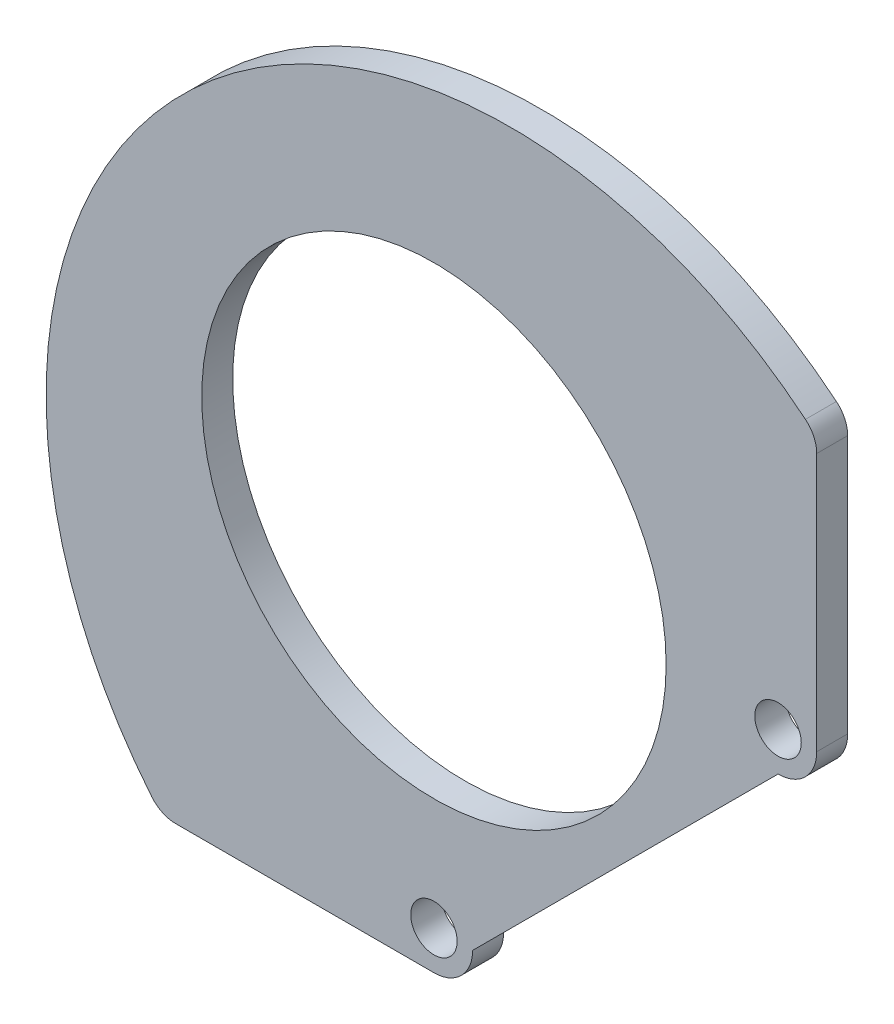
ISO-10303-21;
HEADER;
FILE_DESCRIPTION(('STEP AP214'),'2;1');
FILE_NAME('part.step','',(''),(''),'','','');
FILE_SCHEMA(('AUTOMOTIVE_DESIGN { 1 0 10303 214 1 1 1 1 }'));
ENDSEC;
DATA;
#1=APPLICATION_CONTEXT('core data for automotive mechanical design processes');
#2=APPLICATION_PROTOCOL_DEFINITION('international standard','automotive_design',2000,#1);
#3=PRODUCT_CONTEXT('',#1,'mechanical');
#4=PRODUCT('Part','Part','',(#3));
#5=PRODUCT_RELATED_PRODUCT_CATEGORY('part','',(#4));
#6=PRODUCT_DEFINITION_FORMATION('','',#4);
#7=PRODUCT_DEFINITION_CONTEXT('part definition',#1,'design');
#8=PRODUCT_DEFINITION('design','',#6,#7);
#9=PRODUCT_DEFINITION_SHAPE('','',#8);
#10=(LENGTH_UNIT() NAMED_UNIT(*) SI_UNIT(.MILLI.,.METRE.));
#11=(NAMED_UNIT(*) PLANE_ANGLE_UNIT() SI_UNIT($,.RADIAN.));
#12=(NAMED_UNIT(*) SI_UNIT($,.STERADIAN.) SOLID_ANGLE_UNIT());
#13=UNCERTAINTY_MEASURE_WITH_UNIT(LENGTH_MEASURE(1.E-05),#10,'distance_accuracy_value','');
#14=(GEOMETRIC_REPRESENTATION_CONTEXT(3) GLOBAL_UNCERTAINTY_ASSIGNED_CONTEXT((#13)) GLOBAL_UNIT_ASSIGNED_CONTEXT((#10,
#11,#12)) REPRESENTATION_CONTEXT('',''));
#15=CARTESIAN_POINT('',(0.,0.,0.));
#16=DIRECTION('',(0.,0.,1.));
#17=DIRECTION('',(1.,0.,0.));
#18=AXIS2_PLACEMENT_3D('',#15,#16,#17);
#19=CARTESIAN_POINT('',(-4.94974746830583,4.94974746830583,2.));
#20=DIRECTION('',(0.,0.,-1.));
#21=DIRECTION('',(-1.,0.,0.));
#22=AXIS2_PLACEMENT_3D('',#19,#20,#21);
#23=CYLINDRICAL_SURFACE('',#22,15.);
#24=CARTESIAN_POINT('',(-4.94974746830583,4.94974746830583,2.));
#25=DIRECTION('',(0.,0.,1.));
#26=DIRECTION('',(1.,0.,0.));
#27=AXIS2_PLACEMENT_3D('',#24,#25,#26);
#28=CIRCLE('',#27,15.);
#29=CARTESIAN_POINT('',(10.0502525316942,4.94974746830583,2.));
#30=VERTEX_POINT('',#29);
#31=EDGE_CURVE('E234',#30,#30,#28,.T.);
#32=ORIENTED_EDGE('',*,*,#31,.T.);
#33=EDGE_LOOP('',(#32));
#34=FACE_BOUND('',#33,.T.);
#35=CARTESIAN_POINT('',(-4.94974746830583,4.94974746830583,0.));
#36=DIRECTION('',(0.,0.,1.));
#37=DIRECTION('',(1.,0.,0.));
#38=AXIS2_PLACEMENT_3D('',#35,#36,#37);
#39=CIRCLE('',#38,15.);
#40=CARTESIAN_POINT('',(10.0502525316942,4.94974746830583,0.));
#41=VERTEX_POINT('',#40);
#42=EDGE_CURVE('E224',#41,#41,#39,.T.);
#43=ORIENTED_EDGE('',*,*,#42,.F.);
#44=EDGE_LOOP('',(#43));
#45=FACE_BOUND('',#44,.T.);
#46=ADVANCED_FACE('F133',(#34,#45),#23,.F.);
#47=CARTESIAN_POINT('',(19.7776770206899,0.,2.));
#48=DIRECTION('',(-1.,0.,0.));
#49=DIRECTION('',(0.,0.,1.));
#50=AXIS2_PLACEMENT_3D('',#47,#48,#49);
#51=PLANE('',#50);
#52=DIRECTION('',(0.,1.,0.));
#53=VECTOR('',#52,1.);
#54=CARTESIAN_POINT('',(19.7776770206899,0.,0.));
#55=LINE('',#54,#53);
#56=CARTESIAN_POINT('',(19.7776770206899,4.94974746830583,0.));
#57=VERTEX_POINT('',#56);
#58=CARTESIAN_POINT('',(19.7776770206899,21.632249068186,0.));
#59=VERTEX_POINT('',#58);
#60=EDGE_CURVE('E238',#57,#59,#55,.T.);
#61=ORIENTED_EDGE('',*,*,#60,.T.);
#62=DIRECTION('',(0.,0.,-1.));
#63=VECTOR('',#62,1.);
#64=CARTESIAN_POINT('',(19.7776770206899,21.632249068186,2.));
#65=LINE('',#64,#63);
#66=CARTESIAN_POINT('',(19.7776770206899,21.632249068186,2.));
#67=VERTEX_POINT('',#66);
#68=EDGE_CURVE('E156',#59,#67,#65,.F.);
#69=ORIENTED_EDGE('',*,*,#68,.T.);
#70=DIRECTION('',(0.,1.,0.));
#71=VECTOR('',#70,1.);
#72=CARTESIAN_POINT('',(19.7776770206899,0.,2.));
#73=LINE('',#72,#71);
#74=CARTESIAN_POINT('',(19.7776770206899,4.94974746830583,2.));
#75=VERTEX_POINT('',#74);
#76=EDGE_CURVE('E215',#75,#67,#73,.T.);
#77=ORIENTED_EDGE('',*,*,#76,.F.);
#78=DIRECTION('',(0.,0.,-1.));
#79=VECTOR('',#78,1.);
#80=CARTESIAN_POINT('',(19.7776770206899,4.94974746830583,2.));
#81=LINE('',#80,#79);
#82=EDGE_CURVE('E202',#75,#57,#81,.T.);
#83=ORIENTED_EDGE('',*,*,#82,.T.);
#84=EDGE_LOOP('',(#61,#69,#77,#83));
#85=FACE_BOUND('',#84,.T.);
#86=ADVANCED_FACE('F222',(#85),#51,.F.);
#87=CARTESIAN_POINT('',(0.,0.,2.));
#88=DIRECTION('',(0.,0.,-1.));
#89=DIRECTION('',(-1.,0.,0.));
#90=AXIS2_PLACEMENT_3D('',#87,#88,#89);
#91=CYLINDRICAL_SURFACE('',#90,30.);
#92=CARTESIAN_POINT('',(0.,0.,2.));
#93=DIRECTION('',(0.,0.,1.));
#94=DIRECTION('',(1.,0.,0.));
#95=AXIS2_PLACEMENT_3D('',#92,#93,#94);
#96=CIRCLE('',#95,30.);
#97=CARTESIAN_POINT('',(19.0475110935963,23.1774097159136,2.));
#98=VERTEX_POINT('',#97);
#99=CARTESIAN_POINT('',(-23.1774097159136,-19.0475110935963,2.));
#100=VERTEX_POINT('',#99);
#101=EDGE_CURVE('E223',#98,#100,#96,.T.);
#102=ORIENTED_EDGE('',*,*,#101,.F.);
#103=DIRECTION('',(0.,0.,-1.));
#104=VECTOR('',#103,1.);
#105=CARTESIAN_POINT('',(19.0475110935964,23.1774097159136,2.));
#106=LINE('',#105,#104);
#107=CARTESIAN_POINT('',(19.0475110935963,23.1774097159136,0.));
#108=VERTEX_POINT('',#107);
#109=EDGE_CURVE('E270',#98,#108,#106,.T.);
#110=ORIENTED_EDGE('',*,*,#109,.T.);
#111=CARTESIAN_POINT('',(0.,0.,0.));
#112=DIRECTION('',(0.,0.,1.));
#113=DIRECTION('',(1.,0.,0.));
#114=AXIS2_PLACEMENT_3D('',#111,#112,#113);
#115=CIRCLE('',#114,30.);
#116=CARTESIAN_POINT('',(-23.1774097159136,-19.0475110935963,0.));
#117=VERTEX_POINT('',#116);
#118=EDGE_CURVE('E240',#108,#117,#115,.T.);
#119=ORIENTED_EDGE('',*,*,#118,.T.);
#120=DIRECTION('',(0.,0.,-1.));
#121=VECTOR('',#120,1.);
#122=CARTESIAN_POINT('',(-23.1774097159136,-19.0475110935964,2.));
#123=LINE('',#122,#121);
#124=EDGE_CURVE('E210',#117,#100,#123,.F.);
#125=ORIENTED_EDGE('',*,*,#124,.T.);
#126=EDGE_LOOP('',(#102,#110,#119,#125));
#127=FACE_BOUND('',#126,.T.);
#128=ADVANCED_FACE('F282',(#127),#91,.T.);
#129=CARTESIAN_POINT('',(0.,-19.7776770206899,2.));
#130=DIRECTION('',(0.,-1.,0.));
#131=DIRECTION('',(0.,0.,-1.));
#132=AXIS2_PLACEMENT_3D('',#129,#130,#131);
#133=PLANE('',#132);
#134=DIRECTION('',(-1.,0.,0.));
#135=VECTOR('',#134,1.);
#136=CARTESIAN_POINT('',(0.,-19.7776770206899,2.));
#137=LINE('',#136,#135);
#138=CARTESIAN_POINT('',(-4.94974746830583,-19.7776770206899,2.));
#139=VERTEX_POINT('',#138);
#140=CARTESIAN_POINT('',(-21.632249068186,-19.7776770206899,2.));
#141=VERTEX_POINT('',#140);
#142=EDGE_CURVE('E226',#139,#141,#137,.T.);
#143=ORIENTED_EDGE('',*,*,#142,.T.);
#144=DIRECTION('',(0.,0.,1.));
#145=VECTOR('',#144,1.);
#146=CARTESIAN_POINT('',(-21.632249068186,-19.7776770206899,0.));
#147=LINE('',#146,#145);
#148=CARTESIAN_POINT('',(-21.632249068186,-19.7776770206899,0.));
#149=VERTEX_POINT('',#148);
#150=EDGE_CURVE('E12',#141,#149,#147,.F.);
#151=ORIENTED_EDGE('',*,*,#150,.T.);
#152=DIRECTION('',(-1.,0.,0.));
#153=VECTOR('',#152,1.);
#154=CARTESIAN_POINT('',(0.,-19.7776770206899,0.));
#155=LINE('',#154,#153);
#156=CARTESIAN_POINT('',(-4.94974746830583,-19.7776770206899,0.));
#157=VERTEX_POINT('',#156);
#158=EDGE_CURVE('E244',#157,#149,#155,.T.);
#159=ORIENTED_EDGE('',*,*,#158,.F.);
#160=DIRECTION('',(0.,0.,-1.));
#161=VECTOR('',#160,1.);
#162=CARTESIAN_POINT('',(-4.94974746830583,-19.7776770206899,2.));
#163=LINE('',#162,#161);
#164=EDGE_CURVE('E211',#139,#157,#163,.T.);
#165=ORIENTED_EDGE('',*,*,#164,.F.);
#166=EDGE_LOOP('',(#143,#151,#159,#165));
#167=FACE_BOUND('',#166,.T.);
#168=ADVANCED_FACE('F293',(#167),#133,.T.);
#169=CARTESIAN_POINT('',(7.41396477619205,-7.41396477619205,2.));
#170=DIRECTION('',(-0.707106781186548,0.707106781186547,0.));
#171=DIRECTION('',(-0.707106781186547,-0.707106781186548,0.));
#172=AXIS2_PLACEMENT_3D('',#169,#170,#171);
#173=PLANE('',#172);
#174=DIRECTION('',(0.707106781186547,0.707106781186548,0.));
#175=VECTOR('',#174,1.);
#176=CARTESIAN_POINT('',(7.41396477619205,-7.41396477619205,0.));
#177=LINE('',#176,#175);
#178=CARTESIAN_POINT('',(-2.44974746830583,-17.2776770206899,0.));
#179=VERTEX_POINT('',#178);
#180=CARTESIAN_POINT('',(17.2776770206899,2.44974746830583,0.));
#181=VERTEX_POINT('',#180);
#182=EDGE_CURVE('E229',#179,#181,#177,.T.);
#183=ORIENTED_EDGE('',*,*,#182,.T.);
#184=DIRECTION('',(0.,0.,-1.));
#185=VECTOR('',#184,1.);
#186=CARTESIAN_POINT('',(17.2776770206899,2.44974746830583,2.));
#187=LINE('',#186,#185);
#188=CARTESIAN_POINT('',(17.2776770206899,2.44974746830583,2.));
#189=VERTEX_POINT('',#188);
#190=EDGE_CURVE('E237',#189,#181,#187,.T.);
#191=ORIENTED_EDGE('',*,*,#190,.F.);
#192=DIRECTION('',(0.707106781186547,0.707106781186548,0.));
#193=VECTOR('',#192,1.);
#194=CARTESIAN_POINT('',(7.41396477619205,-7.41396477619205,2.));
#195=LINE('',#194,#193);
#196=CARTESIAN_POINT('',(-2.44974746830583,-17.2776770206899,2.));
#197=VERTEX_POINT('',#196);
#198=EDGE_CURVE('E219',#197,#189,#195,.T.);
#199=ORIENTED_EDGE('',*,*,#198,.F.);
#200=DIRECTION('',(0.,0.,-1.));
#201=VECTOR('',#200,1.);
#202=CARTESIAN_POINT('',(-2.44974746830583,-17.2776770206899,2.));
#203=LINE('',#202,#201);
#204=EDGE_CURVE('E250',#197,#179,#203,.T.);
#205=ORIENTED_EDGE('',*,*,#204,.T.);
#206=EDGE_LOOP('',(#183,#191,#199,#205));
#207=FACE_BOUND('',#206,.T.);
#208=ADVANCED_FACE('F300',(#207),#173,.F.);
#209=CARTESIAN_POINT('',(0.,0.,0.));
#210=DIRECTION('',(0.,0.,1.));
#211=DIRECTION('',(1.,0.,0.));
#212=AXIS2_PLACEMENT_3D('',#209,#210,#211);
#213=PLANE('',#212);
#214=ORIENTED_EDGE('',*,*,#118,.F.);
#215=CARTESIAN_POINT('',(17.7776770206899,21.632249068186,0.));
#216=DIRECTION('',(0.,0.,1.));
#217=DIRECTION('',(1.,0.,0.));
#218=AXIS2_PLACEMENT_3D('',#215,#216,#217);
#219=CIRCLE('',#218,2.);
#220=EDGE_CURVE('E275',#108,#59,#219,.F.);
#221=ORIENTED_EDGE('',*,*,#220,.T.);
#222=ORIENTED_EDGE('',*,*,#60,.F.);
#223=CARTESIAN_POINT('',(17.2776770206899,4.94974746830583,0.));
#224=DIRECTION('',(0.,0.,1.));
#225=DIRECTION('',(1.,0.,0.));
#226=AXIS2_PLACEMENT_3D('',#223,#224,#225);
#227=CIRCLE('',#226,2.5);
#228=EDGE_CURVE('E208',#181,#57,#227,.T.);
#229=ORIENTED_EDGE('',*,*,#228,.F.);
#230=ORIENTED_EDGE('',*,*,#182,.F.);
#231=CARTESIAN_POINT('',(-4.94974746830583,-17.2776770206899,0.));
#232=DIRECTION('',(0.,0.,1.));
#233=DIRECTION('',(1.,0.,0.));
#234=AXIS2_PLACEMENT_3D('',#231,#232,#233);
#235=CIRCLE('',#234,2.5);
#236=EDGE_CURVE('E256',#157,#179,#235,.T.);
#237=ORIENTED_EDGE('',*,*,#236,.F.);
#238=ORIENTED_EDGE('',*,*,#158,.T.);
#239=CARTESIAN_POINT('',(-21.632249068186,-17.7776770206899,0.));
#240=DIRECTION('',(0.,0.,1.));
#241=DIRECTION('',(1.,0.,0.));
#242=AXIS2_PLACEMENT_3D('',#239,#240,#241);
#243=CIRCLE('',#242,2.);
#244=EDGE_CURVE('E273',#149,#117,#243,.F.);
#245=ORIENTED_EDGE('',*,*,#244,.T.);
#246=EDGE_LOOP('',(#214,#221,#222,#229,#230,#237,#238,#245));
#247=FACE_BOUND('',#246,.T.);
#248=ORIENTED_EDGE('',*,*,#42,.T.);
#249=EDGE_LOOP('',(#248));
#250=FACE_BOUND('',#249,.T.);
#251=CARTESIAN_POINT('',(-4.94974746830583,-17.2776770206899,0.));
#252=DIRECTION('',(0.,0.,1.));
#253=DIRECTION('',(1.,0.,0.));
#254=AXIS2_PLACEMENT_3D('',#251,#252,#253);
#255=CIRCLE('',#254,1.5);
#256=CARTESIAN_POINT('',(-3.44974746830583,-17.2776770206899,0.));
#257=VERTEX_POINT('',#256);
#258=EDGE_CURVE('E220',#257,#257,#255,.T.);
#259=ORIENTED_EDGE('',*,*,#258,.T.);
#260=EDGE_LOOP('',(#259));
#261=FACE_BOUND('',#260,.T.);
#262=CARTESIAN_POINT('',(17.2776770206899,4.94974746830583,0.));
#263=DIRECTION('',(0.,0.,1.));
#264=DIRECTION('',(1.,0.,0.));
#265=AXIS2_PLACEMENT_3D('',#262,#263,#264);
#266=CIRCLE('',#265,1.5);
#267=CARTESIAN_POINT('',(18.7776770206899,4.94974746830583,0.));
#268=VERTEX_POINT('',#267);
#269=EDGE_CURVE('E265',#268,#268,#266,.T.);
#270=ORIENTED_EDGE('',*,*,#269,.T.);
#271=EDGE_LOOP('',(#270));
#272=FACE_BOUND('',#271,.T.);
#273=ADVANCED_FACE('F287',(#247,#250,#261,#272),#213,.F.);
#274=CARTESIAN_POINT('',(0.,0.,2.));
#275=DIRECTION('',(0.,0.,1.));
#276=DIRECTION('',(1.,0.,0.));
#277=AXIS2_PLACEMENT_3D('',#274,#275,#276);
#278=PLANE('',#277);
#279=ORIENTED_EDGE('',*,*,#76,.T.);
#280=CARTESIAN_POINT('',(17.7776770206899,21.632249068186,2.));
#281=DIRECTION('',(0.,0.,1.));
#282=DIRECTION('',(1.,0.,0.));
#283=AXIS2_PLACEMENT_3D('',#280,#281,#282);
#284=CIRCLE('',#283,2.);
#285=EDGE_CURVE('E141',#67,#98,#284,.T.);
#286=ORIENTED_EDGE('',*,*,#285,.T.);
#287=ORIENTED_EDGE('',*,*,#101,.T.);
#288=CARTESIAN_POINT('',(-21.632249068186,-17.7776770206899,2.));
#289=DIRECTION('',(0.,0.,1.));
#290=DIRECTION('',(1.,0.,0.));
#291=AXIS2_PLACEMENT_3D('',#288,#289,#290);
#292=CIRCLE('',#291,2.);
#293=EDGE_CURVE('E148',#100,#141,#292,.T.);
#294=ORIENTED_EDGE('',*,*,#293,.T.);
#295=ORIENTED_EDGE('',*,*,#142,.F.);
#296=CARTESIAN_POINT('',(-4.94974746830583,-17.2776770206899,2.));
#297=DIRECTION('',(0.,0.,1.));
#298=DIRECTION('',(1.,0.,0.));
#299=AXIS2_PLACEMENT_3D('',#296,#297,#298);
#300=CIRCLE('',#299,2.5);
#301=EDGE_CURVE('E241',#139,#197,#300,.T.);
#302=ORIENTED_EDGE('',*,*,#301,.T.);
#303=ORIENTED_EDGE('',*,*,#198,.T.);
#304=CARTESIAN_POINT('',(17.2776770206899,4.94974746830583,2.));
#305=DIRECTION('',(0.,0.,1.));
#306=DIRECTION('',(1.,0.,0.));
#307=AXIS2_PLACEMENT_3D('',#304,#305,#306);
#308=CIRCLE('',#307,2.5);
#309=EDGE_CURVE('E205',#189,#75,#308,.T.);
#310=ORIENTED_EDGE('',*,*,#309,.T.);
#311=EDGE_LOOP('',(#279,#286,#287,#294,#295,#302,#303,#310));
#312=FACE_BOUND('',#311,.T.);
#313=ORIENTED_EDGE('',*,*,#31,.F.);
#314=EDGE_LOOP('',(#313));
#315=FACE_BOUND('',#314,.T.);
#316=CARTESIAN_POINT('',(-4.94974746830583,-17.2776770206899,2.));
#317=DIRECTION('',(0.,0.,1.));
#318=DIRECTION('',(1.,0.,0.));
#319=AXIS2_PLACEMENT_3D('',#316,#317,#318);
#320=CIRCLE('',#319,1.5);
#321=CARTESIAN_POINT('',(-3.44974746830583,-17.2776770206899,2.));
#322=VERTEX_POINT('',#321);
#323=EDGE_CURVE('E253',#322,#322,#320,.T.);
#324=ORIENTED_EDGE('',*,*,#323,.F.);
#325=EDGE_LOOP('',(#324));
#326=FACE_BOUND('',#325,.T.);
#327=CARTESIAN_POINT('',(17.2776770206899,4.94974746830583,2.));
#328=DIRECTION('',(0.,0.,1.));
#329=DIRECTION('',(1.,0.,0.));
#330=AXIS2_PLACEMENT_3D('',#327,#328,#329);
#331=CIRCLE('',#330,1.5);
#332=CARTESIAN_POINT('',(18.7776770206899,4.94974746830583,2.));
#333=VERTEX_POINT('',#332);
#334=EDGE_CURVE('E262',#333,#333,#331,.T.);
#335=ORIENTED_EDGE('',*,*,#334,.F.);
#336=EDGE_LOOP('',(#335));
#337=FACE_BOUND('',#336,.T.);
#338=ADVANCED_FACE('F213',(#312,#315,#326,#337),#278,.T.);
#339=CARTESIAN_POINT('',(17.2776770206899,4.94974746830583,2.));
#340=DIRECTION('',(0.,0.,-1.));
#341=DIRECTION('',(-1.,0.,0.));
#342=AXIS2_PLACEMENT_3D('',#339,#340,#341);
#343=CYLINDRICAL_SURFACE('',#342,1.5);
#344=ORIENTED_EDGE('',*,*,#334,.T.);
#345=EDGE_LOOP('',(#344));
#346=FACE_BOUND('',#345,.T.);
#347=ORIENTED_EDGE('',*,*,#269,.F.);
#348=EDGE_LOOP('',(#347));
#349=FACE_BOUND('',#348,.T.);
#350=ADVANCED_FACE('F319',(#346,#349),#343,.F.);
#351=CARTESIAN_POINT('',(17.2776770206899,4.94974746830583,2.));
#352=DIRECTION('',(0.,0.,-1.));
#353=DIRECTION('',(-1.,0.,0.));
#354=AXIS2_PLACEMENT_3D('',#351,#352,#353);
#355=CYLINDRICAL_SURFACE('',#354,2.5);
#356=ORIENTED_EDGE('',*,*,#228,.T.);
#357=ORIENTED_EDGE('',*,*,#82,.F.);
#358=ORIENTED_EDGE('',*,*,#309,.F.);
#359=ORIENTED_EDGE('',*,*,#190,.T.);
#360=EDGE_LOOP('',(#356,#357,#358,#359));
#361=FACE_BOUND('',#360,.T.);
#362=ADVANCED_FACE('F204',(#361),#355,.T.);
#363=CARTESIAN_POINT('',(-4.94974746830583,-17.2776770206899,2.));
#364=DIRECTION('',(0.,0.,-1.));
#365=DIRECTION('',(-1.,0.,0.));
#366=AXIS2_PLACEMENT_3D('',#363,#364,#365);
#367=CYLINDRICAL_SURFACE('',#366,1.5);
#368=ORIENTED_EDGE('',*,*,#323,.T.);
#369=EDGE_LOOP('',(#368));
#370=FACE_BOUND('',#369,.T.);
#371=ORIENTED_EDGE('',*,*,#258,.F.);
#372=EDGE_LOOP('',(#371));
#373=FACE_BOUND('',#372,.T.);
#374=ADVANCED_FACE('F326',(#370,#373),#367,.F.);
#375=CARTESIAN_POINT('',(-4.94974746830583,-17.2776770206899,2.));
#376=DIRECTION('',(0.,0.,-1.));
#377=DIRECTION('',(-1.,0.,0.));
#378=AXIS2_PLACEMENT_3D('',#375,#376,#377);
#379=CYLINDRICAL_SURFACE('',#378,2.5);
#380=ORIENTED_EDGE('',*,*,#301,.F.);
#381=ORIENTED_EDGE('',*,*,#164,.T.);
#382=ORIENTED_EDGE('',*,*,#236,.T.);
#383=ORIENTED_EDGE('',*,*,#204,.F.);
#384=EDGE_LOOP('',(#380,#381,#382,#383));
#385=FACE_BOUND('',#384,.T.);
#386=ADVANCED_FACE('F298',(#385),#379,.T.);
#387=CARTESIAN_POINT('',(17.7776770206899,21.632249068186,2.));
#388=DIRECTION('',(0.,0.,-1.));
#389=DIRECTION('',(-1.,0.,0.));
#390=AXIS2_PLACEMENT_3D('',#387,#388,#389);
#391=CYLINDRICAL_SURFACE('',#390,2.);
#392=ORIENTED_EDGE('',*,*,#285,.F.);
#393=ORIENTED_EDGE('',*,*,#68,.F.);
#394=ORIENTED_EDGE('',*,*,#220,.F.);
#395=ORIENTED_EDGE('',*,*,#109,.F.);
#396=EDGE_LOOP('',(#392,#393,#394,#395));
#397=FACE_BOUND('',#396,.T.);
#398=ADVANCED_FACE('F285',(#397),#391,.T.);
#399=CARTESIAN_POINT('',(-21.632249068186,-17.7776770206899,2.));
#400=DIRECTION('',(0.,0.,-1.));
#401=DIRECTION('',(-1.,0.,0.));
#402=AXIS2_PLACEMENT_3D('',#399,#400,#401);
#403=CYLINDRICAL_SURFACE('',#402,2.);
#404=ORIENTED_EDGE('',*,*,#293,.F.);
#405=ORIENTED_EDGE('',*,*,#124,.F.);
#406=ORIENTED_EDGE('',*,*,#244,.F.);
#407=ORIENTED_EDGE('',*,*,#150,.F.);
#408=EDGE_LOOP('',(#404,#405,#406,#407));
#409=FACE_BOUND('',#408,.T.);
#410=ADVANCED_FACE('F135',(#409),#403,.T.);
#411=CLOSED_SHELL('',(#46,#86,#128,#168,#208,#273,#338,#350,#362,#374,#386,#398,#410));
#412=MANIFOLD_SOLID_BREP('B2',#411);
#413=ADVANCED_BREP_SHAPE_REPRESENTATION('',(#18,#412),#14);
#414=SHAPE_DEFINITION_REPRESENTATION(#9,#413);
ENDSEC;
END-ISO-10303-21;
